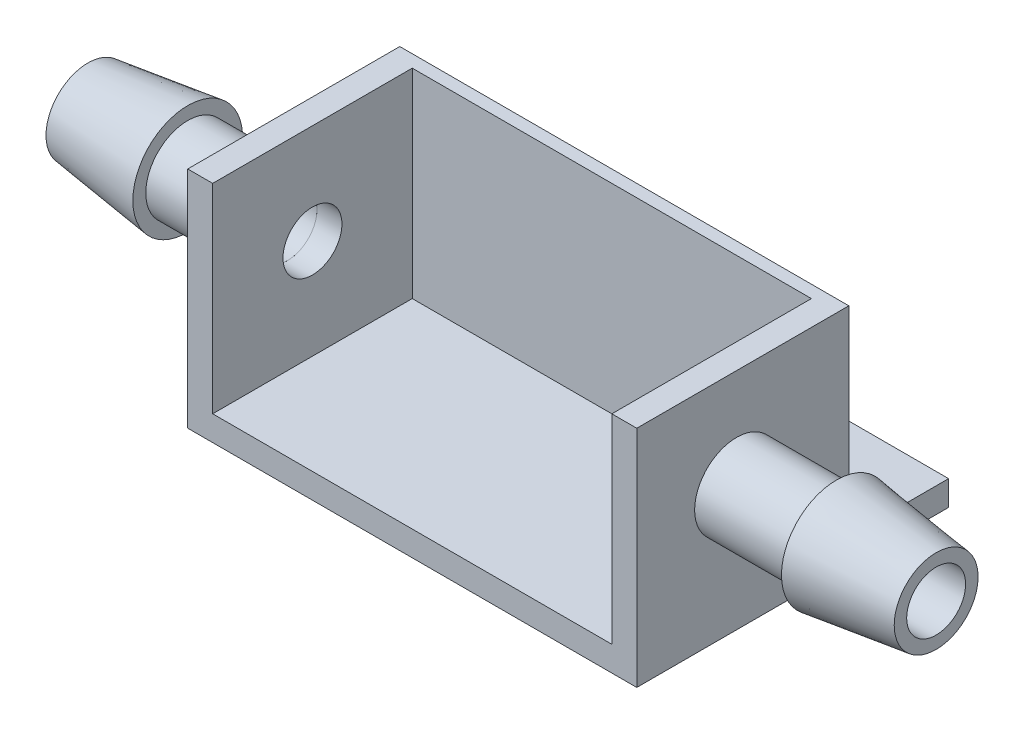
ISO-10303-21;
HEADER;
FILE_DESCRIPTION(('STEP AP214'),'2;1');
FILE_NAME('part.step','',(''),(''),'','','');
FILE_SCHEMA(('AUTOMOTIVE_DESIGN { 1 0 10303 214 1 1 1 1 }'));
ENDSEC;
DATA;
#1=APPLICATION_CONTEXT('core data for automotive mechanical design processes');
#2=APPLICATION_PROTOCOL_DEFINITION('international standard','automotive_design',2000,#1);
#3=PRODUCT_CONTEXT('',#1,'mechanical');
#4=PRODUCT('Part','Part','',(#3));
#5=PRODUCT_RELATED_PRODUCT_CATEGORY('part','',(#4));
#6=PRODUCT_DEFINITION_FORMATION('','',#4);
#7=PRODUCT_DEFINITION_CONTEXT('part definition',#1,'design');
#8=PRODUCT_DEFINITION('design','',#6,#7);
#9=PRODUCT_DEFINITION_SHAPE('','',#8);
#10=(LENGTH_UNIT() NAMED_UNIT(*) SI_UNIT(.MILLI.,.METRE.));
#11=(NAMED_UNIT(*) PLANE_ANGLE_UNIT() SI_UNIT($,.RADIAN.));
#12=(NAMED_UNIT(*) SI_UNIT($,.STERADIAN.) SOLID_ANGLE_UNIT());
#13=UNCERTAINTY_MEASURE_WITH_UNIT(LENGTH_MEASURE(1.E-05),#10,'distance_accuracy_value','');
#14=(GEOMETRIC_REPRESENTATION_CONTEXT(3) GLOBAL_UNCERTAINTY_ASSIGNED_CONTEXT((#13)) GLOBAL_UNIT_ASSIGNED_CONTEXT((#10,
#11,#12)) REPRESENTATION_CONTEXT('',''));
#15=CARTESIAN_POINT('',(0.,0.,0.));
#16=DIRECTION('',(0.,0.,1.));
#17=DIRECTION('',(1.,0.,0.));
#18=AXIS2_PLACEMENT_3D('',#15,#16,#17);
#19=CARTESIAN_POINT('',(-76.2,31.75,0.));
#20=DIRECTION('',(-1.,0.,0.));
#21=DIRECTION('',(0.,0.,1.));
#22=AXIS2_PLACEMENT_3D('',#19,#20,#21);
#23=CYLINDRICAL_SURFACE('',#22,7.50000000000003);
#24=CARTESIAN_POINT('',(107.95,31.75,0.));
#25=DIRECTION('',(-1.,0.,0.));
#26=DIRECTION('',(0.,0.,1.));
#27=AXIS2_PLACEMENT_3D('',#24,#25,#26);
#28=CIRCLE('',#27,7.50000000000003);
#29=CARTESIAN_POINT('',(107.95,31.75,7.50000000000003));
#30=VERTEX_POINT('',#29);
#31=EDGE_CURVE('E62',#30,#30,#28,.T.);
#32=ORIENTED_EDGE('',*,*,#31,.F.);
#33=EDGE_LOOP('',(#32));
#34=FACE_BOUND('',#33,.T.);
#35=CARTESIAN_POINT('',(57.15,31.75,0.));
#36=DIRECTION('',(-1.,0.,0.));
#37=DIRECTION('',(0.,0.,1.));
#38=AXIS2_PLACEMENT_3D('',#35,#36,#37);
#39=CIRCLE('',#38,7.50000000000002);
#40=CARTESIAN_POINT('',(57.15,31.75,7.50000000000002));
#41=VERTEX_POINT('',#40);
#42=EDGE_CURVE('E11',#41,#41,#39,.T.);
#43=ORIENTED_EDGE('',*,*,#42,.T.);
#44=EDGE_LOOP('',(#43));
#45=FACE_BOUND('',#44,.T.);
#46=ADVANCED_FACE('F40',(#34,#45),#23,.F.);
#47=CARTESIAN_POINT('',(57.15,39.25,0.));
#48=DIRECTION('',(1.,0.,0.));
#49=DIRECTION('',(0.,0.,-1.));
#50=AXIS2_PLACEMENT_3D('',#47,#48,#49);
#51=PLANE('',#50);
#52=ORIENTED_EDGE('',*,*,#42,.F.);
#53=EDGE_LOOP('',(#52));
#54=FACE_BOUND('',#53,.T.);
#55=CARTESIAN_POINT('',(57.15,31.75,0.));
#56=DIRECTION('',(-1.,0.,0.));
#57=DIRECTION('',(0.,0.,1.));
#58=AXIS2_PLACEMENT_3D('',#55,#56,#57);
#59=CIRCLE('',#58,10.675);
#60=CARTESIAN_POINT('',(57.15,31.75,10.675));
#61=VERTEX_POINT('',#60);
#62=EDGE_CURVE('E46',#61,#61,#59,.T.);
#63=ORIENTED_EDGE('',*,*,#62,.T.);
#64=EDGE_LOOP('',(#63));
#65=FACE_BOUND('',#64,.T.);
#66=ADVANCED_FACE('F69',(#54,#65),#51,.F.);
#67=CARTESIAN_POINT('',(-76.2,31.75,0.));
#68=DIRECTION('',(-1.,0.,0.));
#69=DIRECTION('',(0.,0.,1.));
#70=AXIS2_PLACEMENT_3D('',#67,#68,#69);
#71=CYLINDRICAL_SURFACE('',#70,10.675);
#72=ORIENTED_EDGE('',*,*,#62,.F.);
#73=EDGE_LOOP('',(#72));
#74=FACE_BOUND('',#73,.T.);
#75=CARTESIAN_POINT('',(82.55,31.75,0.));
#76=DIRECTION('',(-1.,0.,0.));
#77=DIRECTION('',(0.,0.,1.));
#78=AXIS2_PLACEMENT_3D('',#75,#76,#77);
#79=CIRCLE('',#78,10.675);
#80=CARTESIAN_POINT('',(82.55,31.75,10.675));
#81=VERTEX_POINT('',#80);
#82=EDGE_CURVE('E50',#81,#81,#79,.T.);
#83=ORIENTED_EDGE('',*,*,#82,.T.);
#84=EDGE_LOOP('',(#83));
#85=FACE_BOUND('',#84,.T.);
#86=ADVANCED_FACE('F73',(#74,#85),#71,.T.);
#87=CARTESIAN_POINT('',(82.55,42.425,0.));
#88=DIRECTION('',(1.,0.,0.));
#89=DIRECTION('',(0.,0.,-1.));
#90=AXIS2_PLACEMENT_3D('',#87,#88,#89);
#91=PLANE('',#90);
#92=ORIENTED_EDGE('',*,*,#82,.F.);
#93=EDGE_LOOP('',(#92));
#94=FACE_BOUND('',#93,.T.);
#95=CARTESIAN_POINT('',(82.55,31.75,0.));
#96=DIRECTION('',(-1.,0.,0.));
#97=DIRECTION('',(0.,0.,1.));
#98=AXIS2_PLACEMENT_3D('',#95,#96,#97);
#99=CIRCLE('',#98,13.97);
#100=CARTESIAN_POINT('',(82.55,31.75,13.97));
#101=VERTEX_POINT('',#100);
#102=EDGE_CURVE('E54',#101,#101,#99,.T.);
#103=ORIENTED_EDGE('',*,*,#102,.T.);
#104=EDGE_LOOP('',(#103));
#105=FACE_BOUND('',#104,.T.);
#106=ADVANCED_FACE('F78',(#94,#105),#91,.F.);
#107=CARTESIAN_POINT('',(107.95,31.75,0.));
#108=DIRECTION('',(-1.,0.,0.));
#109=DIRECTION('',(0.,0.,1.));
#110=AXIS2_PLACEMENT_3D('',#107,#108,#109);
#111=CONICAL_SURFACE('',#110,10.675,0.129003984032206);
#112=ORIENTED_EDGE('',*,*,#102,.F.);
#113=EDGE_LOOP('',(#112));
#114=FACE_BOUND('',#113,.T.);
#115=CARTESIAN_POINT('',(107.95,31.75,0.));
#116=DIRECTION('',(-1.,0.,0.));
#117=DIRECTION('',(0.,0.,1.));
#118=AXIS2_PLACEMENT_3D('',#115,#116,#117);
#119=CIRCLE('',#118,10.675);
#120=CARTESIAN_POINT('',(107.95,31.75,10.675));
#121=VERTEX_POINT('',#120);
#122=EDGE_CURVE('E59',#121,#121,#119,.T.);
#123=ORIENTED_EDGE('',*,*,#122,.T.);
#124=EDGE_LOOP('',(#123));
#125=FACE_BOUND('',#124,.T.);
#126=ADVANCED_FACE('F84',(#114,#125),#111,.T.);
#127=CARTESIAN_POINT('',(107.95,42.425,0.));
#128=DIRECTION('',(-1.,0.,0.));
#129=DIRECTION('',(0.,0.,1.));
#130=AXIS2_PLACEMENT_3D('',#127,#128,#129);
#131=PLANE('',#130);
#132=ORIENTED_EDGE('',*,*,#122,.F.);
#133=EDGE_LOOP('',(#132));
#134=FACE_BOUND('',#133,.T.);
#135=ORIENTED_EDGE('',*,*,#31,.T.);
#136=EDGE_LOOP('',(#135));
#137=FACE_BOUND('',#136,.T.);
#138=ADVANCED_FACE('F66',(#134,#137),#131,.F.);
#139=CLOSED_SHELL('',(#46,#66,#86,#106,#126,#138));
#140=MANIFOLD_SOLID_BREP('B2',#139);
#141=CARTESIAN_POINT('',(-57.15,39.25,0.));
#142=DIRECTION('',(-1.,0.,0.));
#143=DIRECTION('',(0.,0.,1.));
#144=AXIS2_PLACEMENT_3D('',#141,#142,#143);
#145=PLANE('',#144);
#146=CARTESIAN_POINT('',(-57.15,31.75,0.));
#147=DIRECTION('',(-1.,0.,0.));
#148=DIRECTION('',(0.,0.,1.));
#149=AXIS2_PLACEMENT_3D('',#146,#147,#148);
#150=CIRCLE('',#149,10.675);
#151=CARTESIAN_POINT('',(-57.15,31.75,10.675));
#152=VERTEX_POINT('',#151);
#153=EDGE_CURVE('E39',#152,#152,#150,.T.);
#154=ORIENTED_EDGE('',*,*,#153,.F.);
#155=EDGE_LOOP('',(#154));
#156=FACE_BOUND('',#155,.T.);
#157=CARTESIAN_POINT('',(-57.15,31.75,0.));
#158=DIRECTION('',(-1.,0.,0.));
#159=DIRECTION('',(0.,0.,1.));
#160=AXIS2_PLACEMENT_3D('',#157,#158,#159);
#161=CIRCLE('',#160,7.50000000000001);
#162=CARTESIAN_POINT('',(-57.15,31.75,7.50000000000001));
#163=VERTEX_POINT('',#162);
#164=EDGE_CURVE('E163',#163,#163,#161,.T.);
#165=ORIENTED_EDGE('',*,*,#164,.T.);
#166=EDGE_LOOP('',(#165));
#167=FACE_BOUND('',#166,.T.);
#168=ADVANCED_FACE('F141',(#156,#167),#145,.F.);
#169=CARTESIAN_POINT('',(-76.2,31.75,0.));
#170=DIRECTION('',(-1.,0.,0.));
#171=DIRECTION('',(0.,0.,1.));
#172=AXIS2_PLACEMENT_3D('',#169,#170,#171);
#173=CYLINDRICAL_SURFACE('',#172,10.675);
#174=CARTESIAN_POINT('',(-82.55,31.75,0.));
#175=DIRECTION('',(-1.,0.,0.));
#176=DIRECTION('',(0.,0.,1.));
#177=AXIS2_PLACEMENT_3D('',#174,#175,#176);
#178=CIRCLE('',#177,10.675);
#179=CARTESIAN_POINT('',(-82.55,31.75,10.675));
#180=VERTEX_POINT('',#179);
#181=EDGE_CURVE('E147',#180,#180,#178,.T.);
#182=ORIENTED_EDGE('',*,*,#181,.F.);
#183=EDGE_LOOP('',(#182));
#184=FACE_BOUND('',#183,.T.);
#185=ORIENTED_EDGE('',*,*,#153,.T.);
#186=EDGE_LOOP('',(#185));
#187=FACE_BOUND('',#186,.T.);
#188=ADVANCED_FACE('F188',(#184,#187),#173,.T.);
#189=CARTESIAN_POINT('',(-82.55,42.425,0.));
#190=DIRECTION('',(-1.,0.,0.));
#191=DIRECTION('',(0.,0.,1.));
#192=AXIS2_PLACEMENT_3D('',#189,#190,#191);
#193=PLANE('',#192);
#194=CARTESIAN_POINT('',(-82.55,31.75,0.));
#195=DIRECTION('',(-1.,0.,0.));
#196=DIRECTION('',(0.,0.,1.));
#197=AXIS2_PLACEMENT_3D('',#194,#195,#196);
#198=CIRCLE('',#197,13.97);
#199=CARTESIAN_POINT('',(-82.55,31.75,13.97));
#200=VERTEX_POINT('',#199);
#201=EDGE_CURVE('E151',#200,#200,#198,.T.);
#202=ORIENTED_EDGE('',*,*,#201,.F.);
#203=EDGE_LOOP('',(#202));
#204=FACE_BOUND('',#203,.T.);
#205=ORIENTED_EDGE('',*,*,#181,.T.);
#206=EDGE_LOOP('',(#205));
#207=FACE_BOUND('',#206,.T.);
#208=ADVANCED_FACE('F183',(#204,#207),#193,.F.);
#209=CARTESIAN_POINT('',(-82.55,31.75,0.));
#210=DIRECTION('',(1.,0.,0.));
#211=DIRECTION('',(0.,0.,-1.));
#212=AXIS2_PLACEMENT_3D('',#209,#210,#211);
#213=CONICAL_SURFACE('',#212,13.97,0.129003984032206);
#214=CARTESIAN_POINT('',(-107.95,31.75,0.));
#215=DIRECTION('',(-1.,0.,0.));
#216=DIRECTION('',(0.,0.,1.));
#217=AXIS2_PLACEMENT_3D('',#214,#215,#216);
#218=CIRCLE('',#217,10.675);
#219=CARTESIAN_POINT('',(-107.95,31.75,10.675));
#220=VERTEX_POINT('',#219);
#221=EDGE_CURVE('E155',#220,#220,#218,.T.);
#222=ORIENTED_EDGE('',*,*,#221,.F.);
#223=EDGE_LOOP('',(#222));
#224=FACE_BOUND('',#223,.T.);
#225=ORIENTED_EDGE('',*,*,#201,.T.);
#226=EDGE_LOOP('',(#225));
#227=FACE_BOUND('',#226,.T.);
#228=ADVANCED_FACE('F177',(#224,#227),#213,.T.);
#229=CARTESIAN_POINT('',(-107.95,42.425,0.));
#230=DIRECTION('',(1.,0.,0.));
#231=DIRECTION('',(0.,0.,-1.));
#232=AXIS2_PLACEMENT_3D('',#229,#230,#231);
#233=PLANE('',#232);
#234=CARTESIAN_POINT('',(-107.95,31.75,0.));
#235=DIRECTION('',(-1.,0.,0.));
#236=DIRECTION('',(0.,0.,1.));
#237=AXIS2_PLACEMENT_3D('',#234,#235,#236);
#238=CIRCLE('',#237,7.50000000000001);
#239=CARTESIAN_POINT('',(-107.95,31.75,7.50000000000001));
#240=VERTEX_POINT('',#239);
#241=EDGE_CURVE('E160',#240,#240,#238,.T.);
#242=ORIENTED_EDGE('',*,*,#241,.F.);
#243=EDGE_LOOP('',(#242));
#244=FACE_BOUND('',#243,.T.);
#245=ORIENTED_EDGE('',*,*,#221,.T.);
#246=EDGE_LOOP('',(#245));
#247=FACE_BOUND('',#246,.T.);
#248=ADVANCED_FACE('F171',(#244,#247),#233,.F.);
#249=CARTESIAN_POINT('',(-76.2,31.75,0.));
#250=DIRECTION('',(-1.,0.,0.));
#251=DIRECTION('',(0.,0.,1.));
#252=AXIS2_PLACEMENT_3D('',#249,#250,#251);
#253=CYLINDRICAL_SURFACE('',#252,7.50000000000001);
#254=ORIENTED_EDGE('',*,*,#164,.F.);
#255=EDGE_LOOP('',(#254));
#256=FACE_BOUND('',#255,.T.);
#257=ORIENTED_EDGE('',*,*,#241,.T.);
#258=EDGE_LOOP('',(#257));
#259=FACE_BOUND('',#258,.T.);
#260=ADVANCED_FACE('F168',(#256,#259),#253,.F.);
#261=CLOSED_SHELL('',(#168,#188,#208,#228,#248,#260));
#262=MANIFOLD_SOLID_BREP('B6',#261);
#263=CARTESIAN_POINT('',(0.,0.,-28.575));
#264=DIRECTION('',(0.,0.,-1.));
#265=DIRECTION('',(-1.,0.,0.));
#266=AXIS2_PLACEMENT_3D('',#263,#264,#265);
#267=PLANE('',#266);
#268=DIRECTION('',(0.,-1.,0.));
#269=VECTOR('',#268,1.);
#270=CARTESIAN_POINT('',(57.15,57.15,-28.575));
#271=LINE('',#270,#269);
#272=CARTESIAN_POINT('',(57.15,57.15,-28.575));
#273=VERTEX_POINT('',#272);
#274=CARTESIAN_POINT('',(57.15,6.35,-28.575));
#275=VERTEX_POINT('',#274);
#276=EDGE_CURVE('E392',#273,#275,#271,.T.);
#277=ORIENTED_EDGE('',*,*,#276,.T.);
#278=DIRECTION('',(-1.,0.,0.));
#279=VECTOR('',#278,1.);
#280=CARTESIAN_POINT('',(-57.15,6.35,-28.575));
#281=LINE('',#280,#279);
#282=CARTESIAN_POINT('',(-57.15,6.35,-28.575));
#283=VERTEX_POINT('',#282);
#284=EDGE_CURVE('E378',#275,#283,#281,.T.);
#285=ORIENTED_EDGE('',*,*,#284,.T.);
#286=DIRECTION('',(0.,1.,0.));
#287=VECTOR('',#286,1.);
#288=CARTESIAN_POINT('',(-57.15,57.15,-28.575));
#289=LINE('',#288,#287);
#290=CARTESIAN_POINT('',(-57.15,57.15,-28.575));
#291=VERTEX_POINT('',#290);
#292=EDGE_CURVE('E395',#283,#291,#289,.T.);
#293=ORIENTED_EDGE('',*,*,#292,.T.);
#294=DIRECTION('',(1.,0.,0.));
#295=VECTOR('',#294,1.);
#296=CARTESIAN_POINT('',(57.15,57.15,-28.575));
#297=LINE('',#296,#295);
#298=EDGE_CURVE('E329',#291,#273,#297,.T.);
#299=ORIENTED_EDGE('',*,*,#298,.T.);
#300=EDGE_LOOP('',(#277,#285,#293,#299));
#301=FACE_BOUND('',#300,.T.);
#302=ADVANCED_FACE('F233',(#301),#267,.T.);
#303=CARTESIAN_POINT('',(-57.15,0.,25.4));
#304=DIRECTION('',(0.,1.,0.));
#305=DIRECTION('',(0.,0.,1.));
#306=AXIS2_PLACEMENT_3D('',#303,#304,#305);
#307=PLANE('',#306);
#308=DIRECTION('',(0.,0.,-1.));
#309=VECTOR('',#308,1.);
#310=CARTESIAN_POINT('',(-57.15,0.,25.4));
#311=LINE('',#310,#309);
#312=CARTESIAN_POINT('',(-57.15,0.,25.4));
#313=VERTEX_POINT('',#312);
#314=CARTESIAN_POINT('',(-57.15,0.,-53.975));
#315=VERTEX_POINT('',#314);
#316=EDGE_CURVE('E139',#313,#315,#311,.T.);
#317=ORIENTED_EDGE('',*,*,#316,.T.);
#318=DIRECTION('',(1.,0.,0.));
#319=VECTOR('',#318,1.);
#320=CARTESIAN_POINT('',(-57.15,0.,-53.975));
#321=LINE('',#320,#319);
#322=CARTESIAN_POINT('',(57.15,0.,-53.975));
#323=VERTEX_POINT('',#322);
#324=EDGE_CURVE('E365',#315,#323,#321,.T.);
#325=ORIENTED_EDGE('',*,*,#324,.T.);
#326=DIRECTION('',(0.,0.,-1.));
#327=VECTOR('',#326,1.);
#328=CARTESIAN_POINT('',(57.15,0.,25.4));
#329=LINE('',#328,#327);
#330=CARTESIAN_POINT('',(57.15,0.,25.4));
#331=VERTEX_POINT('',#330);
#332=EDGE_CURVE('E242',#331,#323,#329,.T.);
#333=ORIENTED_EDGE('',*,*,#332,.F.);
#334=DIRECTION('',(1.,0.,0.));
#335=VECTOR('',#334,1.);
#336=CARTESIAN_POINT('',(-57.15,0.,25.4));
#337=LINE('',#336,#335);
#338=EDGE_CURVE('E403',#313,#331,#337,.T.);
#339=ORIENTED_EDGE('',*,*,#338,.F.);
#340=EDGE_LOOP('',(#317,#325,#333,#339));
#341=FACE_BOUND('',#340,.T.);
#342=CARTESIAN_POINT('',(-38.1,0.,-41.2750000000005));
#343=DIRECTION('',(0.,-1.,0.));
#344=DIRECTION('',(0.,0.,-1.));
#345=AXIS2_PLACEMENT_3D('',#342,#343,#344);
#346=CIRCLE('',#345,3.49250000000001);
#347=CARTESIAN_POINT('',(-38.1,0.,-44.7675000000005));
#348=VERTEX_POINT('',#347);
#349=EDGE_CURVE('E440',#348,#348,#346,.T.);
#350=ORIENTED_EDGE('',*,*,#349,.F.);
#351=EDGE_LOOP('',(#350));
#352=FACE_BOUND('',#351,.T.);
#353=CARTESIAN_POINT('',(-12.7,0.,-41.2750000000004));
#354=DIRECTION('',(0.,-1.,0.));
#355=DIRECTION('',(0.,0.,-1.));
#356=AXIS2_PLACEMENT_3D('',#353,#354,#355);
#357=CIRCLE('',#356,3.49250000000001);
#358=CARTESIAN_POINT('',(-12.7,0.,-44.7675000000004));
#359=VERTEX_POINT('',#358);
#360=EDGE_CURVE('E434',#359,#359,#357,.T.);
#361=ORIENTED_EDGE('',*,*,#360,.F.);
#362=EDGE_LOOP('',(#361));
#363=FACE_BOUND('',#362,.T.);
#364=CARTESIAN_POINT('',(12.7,0.,-41.2750000000002));
#365=DIRECTION('',(0.,-1.,0.));
#366=DIRECTION('',(0.,0.,-1.));
#367=AXIS2_PLACEMENT_3D('',#364,#365,#366);
#368=CIRCLE('',#367,3.49250000000001);
#369=CARTESIAN_POINT('',(12.7,0.,-44.7675000000002));
#370=VERTEX_POINT('',#369);
#371=EDGE_CURVE('E428',#370,#370,#368,.T.);
#372=ORIENTED_EDGE('',*,*,#371,.F.);
#373=EDGE_LOOP('',(#372));
#374=FACE_BOUND('',#373,.T.);
#375=CARTESIAN_POINT('',(38.1,0.,-41.275));
#376=DIRECTION('',(0.,-1.,0.));
#377=DIRECTION('',(0.,0.,-1.));
#378=AXIS2_PLACEMENT_3D('',#375,#376,#377);
#379=CIRCLE('',#378,3.49250000000001);
#380=CARTESIAN_POINT('',(38.1,0.,-44.7675));
#381=VERTEX_POINT('',#380);
#382=EDGE_CURVE('E375',#381,#381,#379,.T.);
#383=ORIENTED_EDGE('',*,*,#382,.F.);
#384=EDGE_LOOP('',(#383));
#385=FACE_BOUND('',#384,.T.);
#386=ADVANCED_FACE('F235',(#341,#352,#363,#374,#385),#307,.F.);
#387=CARTESIAN_POINT('',(57.15,6.34999999999999,25.4));
#388=DIRECTION('',(-1.,0.,0.));
#389=DIRECTION('',(0.,0.,1.));
#390=AXIS2_PLACEMENT_3D('',#387,#388,#389);
#391=PLANE('',#390);
#392=CARTESIAN_POINT('',(57.15,31.75,0.));
#393=DIRECTION('',(-1.,0.,0.));
#394=DIRECTION('',(0.,0.,1.));
#395=AXIS2_PLACEMENT_3D('',#392,#393,#394);
#396=CIRCLE('',#395,7.5);
#397=CARTESIAN_POINT('',(57.15,31.75,7.5));
#398=VERTEX_POINT('',#397);
#399=EDGE_CURVE('E388',#398,#398,#396,.T.);
#400=ORIENTED_EDGE('',*,*,#399,.T.);
#401=EDGE_LOOP('',(#400));
#402=FACE_BOUND('',#401,.T.);
#403=ORIENTED_EDGE('',*,*,#332,.T.);
#404=DIRECTION('',(0.,-1.,0.));
#405=VECTOR('',#404,1.);
#406=CARTESIAN_POINT('',(57.15,6.35,-53.975));
#407=LINE('',#406,#405);
#408=CARTESIAN_POINT('',(57.15,6.35,-53.975));
#409=VERTEX_POINT('',#408);
#410=EDGE_CURVE('E351',#409,#323,#407,.T.);
#411=ORIENTED_EDGE('',*,*,#410,.F.);
#412=DIRECTION('',(0.,0.,1.));
#413=VECTOR('',#412,1.);
#414=CARTESIAN_POINT('',(57.15,6.35,-28.575));
#415=LINE('',#414,#413);
#416=EDGE_CURVE('E422',#409,#275,#415,.T.);
#417=ORIENTED_EDGE('',*,*,#416,.T.);
#418=ORIENTED_EDGE('',*,*,#276,.F.);
#419=DIRECTION('',(0.,0.,-1.));
#420=VECTOR('',#419,1.);
#421=CARTESIAN_POINT('',(57.15,57.15,25.4));
#422=LINE('',#421,#420);
#423=CARTESIAN_POINT('',(57.15,57.15,25.4));
#424=VERTEX_POINT('',#423);
#425=EDGE_CURVE('E338',#424,#273,#422,.T.);
#426=ORIENTED_EDGE('',*,*,#425,.F.);
#427=DIRECTION('',(0.,1.,0.));
#428=VECTOR('',#427,1.);
#429=CARTESIAN_POINT('',(57.15,0.,25.4));
#430=LINE('',#429,#428);
#431=EDGE_CURVE('E354',#331,#424,#430,.T.);
#432=ORIENTED_EDGE('',*,*,#431,.F.);
#433=EDGE_LOOP('',(#403,#411,#417,#418,#426,#432));
#434=FACE_BOUND('',#433,.T.);
#435=ADVANCED_FACE('F348',(#402,#434),#391,.F.);
#436=CARTESIAN_POINT('',(50.8,6.34999999999999,25.4));
#437=DIRECTION('',(1.,0.,0.));
#438=DIRECTION('',(0.,0.,-1.));
#439=AXIS2_PLACEMENT_3D('',#436,#437,#438);
#440=PLANE('',#439);
#441=CARTESIAN_POINT('',(50.8,31.75,0.));
#442=DIRECTION('',(1.,0.,0.));
#443=DIRECTION('',(0.,0.,-1.));
#444=AXIS2_PLACEMENT_3D('',#441,#442,#443);
#445=CIRCLE('',#444,7.5);
#446=CARTESIAN_POINT('',(50.8,31.75,-7.5));
#447=VERTEX_POINT('',#446);
#448=EDGE_CURVE('E385',#447,#447,#445,.T.);
#449=ORIENTED_EDGE('',*,*,#448,.T.);
#450=EDGE_LOOP('',(#449));
#451=FACE_BOUND('',#450,.T.);
#452=DIRECTION('',(0.,-1.,0.));
#453=VECTOR('',#452,1.);
#454=CARTESIAN_POINT('',(50.8,6.34999999999999,-25.4));
#455=LINE('',#454,#453);
#456=CARTESIAN_POINT('',(50.8,57.15,-25.4));
#457=VERTEX_POINT('',#456);
#458=CARTESIAN_POINT('',(50.8,6.34999999999999,-25.4));
#459=VERTEX_POINT('',#458);
#460=EDGE_CURVE('E327',#457,#459,#455,.T.);
#461=ORIENTED_EDGE('',*,*,#460,.T.);
#462=DIRECTION('',(0.,0.,-1.));
#463=VECTOR('',#462,1.);
#464=CARTESIAN_POINT('',(50.8,6.34999999999999,25.4));
#465=LINE('',#464,#463);
#466=CARTESIAN_POINT('',(50.8,6.34999999999999,25.4));
#467=VERTEX_POINT('',#466);
#468=EDGE_CURVE('E315',#467,#459,#465,.T.);
#469=ORIENTED_EDGE('',*,*,#468,.F.);
#470=DIRECTION('',(0.,-1.,0.));
#471=VECTOR('',#470,1.);
#472=CARTESIAN_POINT('',(50.8,6.34999999999999,25.4));
#473=LINE('',#472,#471);
#474=CARTESIAN_POINT('',(50.8,57.15,25.4));
#475=VERTEX_POINT('',#474);
#476=EDGE_CURVE('E306',#475,#467,#473,.T.);
#477=ORIENTED_EDGE('',*,*,#476,.F.);
#478=DIRECTION('',(0.,0.,-1.));
#479=VECTOR('',#478,1.);
#480=CARTESIAN_POINT('',(50.8,57.15,25.4));
#481=LINE('',#480,#479);
#482=EDGE_CURVE('E335',#475,#457,#481,.T.);
#483=ORIENTED_EDGE('',*,*,#482,.T.);
#484=EDGE_LOOP('',(#461,#469,#477,#483));
#485=FACE_BOUND('',#484,.T.);
#486=ADVANCED_FACE('F412',(#451,#485),#440,.F.);
#487=CARTESIAN_POINT('',(-50.8,6.34999999999999,25.4));
#488=DIRECTION('',(0.,-1.,0.));
#489=DIRECTION('',(0.,0.,-1.));
#490=AXIS2_PLACEMENT_3D('',#487,#488,#489);
#491=PLANE('',#490);
#492=DIRECTION('',(-1.,0.,0.));
#493=VECTOR('',#492,1.);
#494=CARTESIAN_POINT('',(-50.8,6.34999999999999,-25.4));
#495=LINE('',#494,#493);
#496=CARTESIAN_POINT('',(-50.8,6.34999999999999,-25.4));
#497=VERTEX_POINT('',#496);
#498=EDGE_CURVE('E272',#459,#497,#495,.T.);
#499=ORIENTED_EDGE('',*,*,#498,.T.);
#500=DIRECTION('',(0.,0.,-1.));
#501=VECTOR('',#500,1.);
#502=CARTESIAN_POINT('',(-50.8,6.34999999999999,25.4));
#503=LINE('',#502,#501);
#504=CARTESIAN_POINT('',(-50.8,6.34999999999999,25.4));
#505=VERTEX_POINT('',#504);
#506=EDGE_CURVE('E312',#505,#497,#503,.T.);
#507=ORIENTED_EDGE('',*,*,#506,.F.);
#508=DIRECTION('',(-1.,0.,0.));
#509=VECTOR('',#508,1.);
#510=CARTESIAN_POINT('',(-50.8,6.34999999999999,25.4));
#511=LINE('',#510,#509);
#512=EDGE_CURVE('E299',#467,#505,#511,.T.);
#513=ORIENTED_EDGE('',*,*,#512,.F.);
#514=ORIENTED_EDGE('',*,*,#468,.T.);
#515=EDGE_LOOP('',(#499,#507,#513,#514));
#516=FACE_BOUND('',#515,.T.);
#517=ADVANCED_FACE('F313',(#516),#491,.F.);
#518=CARTESIAN_POINT('',(-50.8,6.34999999999999,25.4));
#519=DIRECTION('',(-1.,0.,0.));
#520=DIRECTION('',(0.,0.,1.));
#521=AXIS2_PLACEMENT_3D('',#518,#519,#520);
#522=PLANE('',#521);
#523=CARTESIAN_POINT('',(-50.8,31.75,0.));
#524=DIRECTION('',(-1.,0.,0.));
#525=DIRECTION('',(0.,0.,1.));
#526=AXIS2_PLACEMENT_3D('',#523,#524,#525);
#527=CIRCLE('',#526,7.5);
#528=CARTESIAN_POINT('',(-50.8,31.75,7.5));
#529=VERTEX_POINT('',#528);
#530=EDGE_CURVE('E382',#529,#529,#527,.T.);
#531=ORIENTED_EDGE('',*,*,#530,.T.);
#532=EDGE_LOOP('',(#531));
#533=FACE_BOUND('',#532,.T.);
#534=DIRECTION('',(0.,1.,0.));
#535=VECTOR('',#534,1.);
#536=CARTESIAN_POINT('',(-50.8,6.34999999999999,-25.4));
#537=LINE('',#536,#535);
#538=CARTESIAN_POINT('',(-50.8,57.15,-25.4));
#539=VERTEX_POINT('',#538);
#540=EDGE_CURVE('E281',#497,#539,#537,.T.);
#541=ORIENTED_EDGE('',*,*,#540,.T.);
#542=DIRECTION('',(0.,0.,-1.));
#543=VECTOR('',#542,1.);
#544=CARTESIAN_POINT('',(-50.8,57.15,25.4));
#545=LINE('',#544,#543);
#546=CARTESIAN_POINT('',(-50.8,57.15,25.4));
#547=VERTEX_POINT('',#546);
#548=EDGE_CURVE('E316',#547,#539,#545,.T.);
#549=ORIENTED_EDGE('',*,*,#548,.F.);
#550=DIRECTION('',(0.,1.,0.));
#551=VECTOR('',#550,1.);
#552=CARTESIAN_POINT('',(-50.8,6.34999999999999,25.4));
#553=LINE('',#552,#551);
#554=EDGE_CURVE('E303',#505,#547,#553,.T.);
#555=ORIENTED_EDGE('',*,*,#554,.F.);
#556=ORIENTED_EDGE('',*,*,#506,.T.);
#557=EDGE_LOOP('',(#541,#549,#555,#556));
#558=FACE_BOUND('',#557,.T.);
#559=ADVANCED_FACE('F318',(#533,#558),#522,.F.);
#560=CARTESIAN_POINT('',(-57.15,57.15,25.4));
#561=DIRECTION('',(0.,-1.,0.));
#562=DIRECTION('',(0.,0.,-1.));
#563=AXIS2_PLACEMENT_3D('',#560,#561,#562);
#564=PLANE('',#563);
#565=ORIENTED_EDGE('',*,*,#548,.T.);
#566=DIRECTION('',(1.,0.,0.));
#567=VECTOR('',#566,1.);
#568=CARTESIAN_POINT('',(57.15,57.15,-25.4));
#569=LINE('',#568,#567);
#570=EDGE_CURVE('E391',#539,#457,#569,.T.);
#571=ORIENTED_EDGE('',*,*,#570,.T.);
#572=ORIENTED_EDGE('',*,*,#482,.F.);
#573=DIRECTION('',(-1.,0.,0.));
#574=VECTOR('',#573,1.);
#575=CARTESIAN_POINT('',(57.15,57.15,25.4));
#576=LINE('',#575,#574);
#577=EDGE_CURVE('E406',#424,#475,#576,.T.);
#578=ORIENTED_EDGE('',*,*,#577,.F.);
#579=ORIENTED_EDGE('',*,*,#425,.T.);
#580=ORIENTED_EDGE('',*,*,#298,.F.);
#581=DIRECTION('',(0.,0.,-1.));
#582=VECTOR('',#581,1.);
#583=CARTESIAN_POINT('',(-57.15,57.15,25.4));
#584=LINE('',#583,#582);
#585=CARTESIAN_POINT('',(-57.15,57.15,25.4));
#586=VERTEX_POINT('',#585);
#587=EDGE_CURVE('E323',#586,#291,#584,.T.);
#588=ORIENTED_EDGE('',*,*,#587,.F.);
#589=DIRECTION('',(-1.,0.,0.));
#590=VECTOR('',#589,1.);
#591=CARTESIAN_POINT('',(-57.15,57.15,25.4));
#592=LINE('',#591,#590);
#593=EDGE_CURVE('E321',#547,#586,#592,.T.);
#594=ORIENTED_EDGE('',*,*,#593,.F.);
#595=EDGE_LOOP('',(#565,#571,#572,#578,#579,#580,#588,#594));
#596=FACE_BOUND('',#595,.T.);
#597=ADVANCED_FACE('F410',(#596),#564,.F.);
#598=CARTESIAN_POINT('',(-57.15,6.34999999999999,25.4));
#599=DIRECTION('',(1.,0.,0.));
#600=DIRECTION('',(0.,0.,-1.));
#601=AXIS2_PLACEMENT_3D('',#598,#599,#600);
#602=PLANE('',#601);
#603=CARTESIAN_POINT('',(-57.15,31.75,0.));
#604=DIRECTION('',(1.,0.,0.));
#605=DIRECTION('',(0.,0.,-1.));
#606=AXIS2_PLACEMENT_3D('',#603,#604,#605);
#607=CIRCLE('',#606,7.5);
#608=CARTESIAN_POINT('',(-57.15,31.75,-7.5));
#609=VERTEX_POINT('',#608);
#610=EDGE_CURVE('E237',#609,#609,#607,.T.);
#611=ORIENTED_EDGE('',*,*,#610,.T.);
#612=EDGE_LOOP('',(#611));
#613=FACE_BOUND('',#612,.T.);
#614=ORIENTED_EDGE('',*,*,#587,.T.);
#615=ORIENTED_EDGE('',*,*,#292,.F.);
#616=DIRECTION('',(0.,0.,-1.));
#617=VECTOR('',#616,1.);
#618=CARTESIAN_POINT('',(-57.15,6.35,-28.575));
#619=LINE('',#618,#617);
#620=CARTESIAN_POINT('',(-57.15,6.35,-53.975));
#621=VERTEX_POINT('',#620);
#622=EDGE_CURVE('E249',#283,#621,#619,.T.);
#623=ORIENTED_EDGE('',*,*,#622,.T.);
#624=DIRECTION('',(0.,-1.,0.));
#625=VECTOR('',#624,1.);
#626=CARTESIAN_POINT('',(-57.15,6.35,-53.975));
#627=LINE('',#626,#625);
#628=EDGE_CURVE('E367',#621,#315,#627,.T.);
#629=ORIENTED_EDGE('',*,*,#628,.T.);
#630=ORIENTED_EDGE('',*,*,#316,.F.);
#631=DIRECTION('',(0.,-1.,0.));
#632=VECTOR('',#631,1.);
#633=CARTESIAN_POINT('',(-57.15,0.,25.4));
#634=LINE('',#633,#632);
#635=EDGE_CURVE('E258',#586,#313,#634,.T.);
#636=ORIENTED_EDGE('',*,*,#635,.F.);
#637=EDGE_LOOP('',(#614,#615,#623,#629,#630,#636));
#638=FACE_BOUND('',#637,.T.);
#639=ADVANCED_FACE('F417',(#613,#638),#602,.F.);
#640=CARTESIAN_POINT('',(0.,0.,25.4));
#641=DIRECTION('',(0.,0.,-1.));
#642=DIRECTION('',(-1.,0.,0.));
#643=AXIS2_PLACEMENT_3D('',#640,#641,#642);
#644=PLANE('',#643);
#645=ORIENTED_EDGE('',*,*,#635,.T.);
#646=ORIENTED_EDGE('',*,*,#338,.T.);
#647=ORIENTED_EDGE('',*,*,#431,.T.);
#648=ORIENTED_EDGE('',*,*,#577,.T.);
#649=ORIENTED_EDGE('',*,*,#476,.T.);
#650=ORIENTED_EDGE('',*,*,#512,.T.);
#651=ORIENTED_EDGE('',*,*,#554,.T.);
#652=ORIENTED_EDGE('',*,*,#593,.T.);
#653=EDGE_LOOP('',(#645,#646,#647,#648,#649,#650,#651,#652));
#654=FACE_BOUND('',#653,.T.);
#655=ADVANCED_FACE('F301',(#654),#644,.F.);
#656=CARTESIAN_POINT('',(0.,0.,-25.4));
#657=DIRECTION('',(0.,0.,-1.));
#658=DIRECTION('',(-1.,0.,0.));
#659=AXIS2_PLACEMENT_3D('',#656,#657,#658);
#660=PLANE('',#659);
#661=ORIENTED_EDGE('',*,*,#540,.F.);
#662=ORIENTED_EDGE('',*,*,#498,.F.);
#663=ORIENTED_EDGE('',*,*,#460,.F.);
#664=ORIENTED_EDGE('',*,*,#570,.F.);
#665=EDGE_LOOP('',(#661,#662,#663,#664));
#666=FACE_BOUND('',#665,.T.);
#667=ADVANCED_FACE('F413',(#666),#660,.F.);
#668=CARTESIAN_POINT('',(-107.95,31.75,0.));
#669=DIRECTION('',(1.,0.,0.));
#670=DIRECTION('',(0.,0.,-1.));
#671=AXIS2_PLACEMENT_3D('',#668,#669,#670);
#672=CYLINDRICAL_SURFACE('',#671,7.5);
#673=ORIENTED_EDGE('',*,*,#610,.F.);
#674=EDGE_LOOP('',(#673));
#675=FACE_BOUND('',#674,.T.);
#676=ORIENTED_EDGE('',*,*,#530,.F.);
#677=EDGE_LOOP('',(#676));
#678=FACE_BOUND('',#677,.T.);
#679=ADVANCED_FACE('F486',(#675,#678),#672,.F.);
#680=ORIENTED_EDGE('',*,*,#448,.F.);
#681=EDGE_LOOP('',(#680));
#682=FACE_BOUND('',#681,.T.);
#683=ORIENTED_EDGE('',*,*,#399,.F.);
#684=EDGE_LOOP('',(#683));
#685=FACE_BOUND('',#684,.T.);
#686=ADVANCED_FACE('F482',(#682,#685),#672,.F.);
#687=CARTESIAN_POINT('',(-57.15,6.35,-53.975));
#688=DIRECTION('',(0.,0.,-1.));
#689=DIRECTION('',(-1.,0.,0.));
#690=AXIS2_PLACEMENT_3D('',#687,#688,#689);
#691=PLANE('',#690);
#692=ORIENTED_EDGE('',*,*,#324,.F.);
#693=ORIENTED_EDGE('',*,*,#628,.F.);
#694=DIRECTION('',(1.,0.,0.));
#695=VECTOR('',#694,1.);
#696=CARTESIAN_POINT('',(-57.15,6.35,-53.975));
#697=LINE('',#696,#695);
#698=EDGE_CURVE('E366',#621,#409,#697,.T.);
#699=ORIENTED_EDGE('',*,*,#698,.T.);
#700=ORIENTED_EDGE('',*,*,#410,.T.);
#701=EDGE_LOOP('',(#692,#693,#699,#700));
#702=FACE_BOUND('',#701,.T.);
#703=ADVANCED_FACE('F363',(#702),#691,.T.);
#704=CARTESIAN_POINT('',(0.,6.35,0.));
#705=DIRECTION('',(0.,-1.,0.));
#706=DIRECTION('',(0.,0.,-1.));
#707=AXIS2_PLACEMENT_3D('',#704,#705,#706);
#708=PLANE('',#707);
#709=CARTESIAN_POINT('',(-38.1,6.35,-41.2750000000005));
#710=DIRECTION('',(0.,-1.,0.));
#711=DIRECTION('',(0.,0.,-1.));
#712=AXIS2_PLACEMENT_3D('',#709,#710,#711);
#713=CIRCLE('',#712,3.49250000000001);
#714=CARTESIAN_POINT('',(-38.1,6.35,-44.7675000000005));
#715=VERTEX_POINT('',#714);
#716=EDGE_CURVE('E437',#715,#715,#713,.T.);
#717=ORIENTED_EDGE('',*,*,#716,.T.);
#718=EDGE_LOOP('',(#717));
#719=FACE_BOUND('',#718,.T.);
#720=CARTESIAN_POINT('',(-12.7,6.35,-41.2750000000004));
#721=DIRECTION('',(0.,-1.,0.));
#722=DIRECTION('',(0.,0.,-1.));
#723=AXIS2_PLACEMENT_3D('',#720,#721,#722);
#724=CIRCLE('',#723,3.49250000000001);
#725=CARTESIAN_POINT('',(-12.7,6.35,-44.7675000000004));
#726=VERTEX_POINT('',#725);
#727=EDGE_CURVE('E431',#726,#726,#724,.T.);
#728=ORIENTED_EDGE('',*,*,#727,.T.);
#729=EDGE_LOOP('',(#728));
#730=FACE_BOUND('',#729,.T.);
#731=CARTESIAN_POINT('',(12.7,6.35,-41.2750000000002));
#732=DIRECTION('',(0.,-1.,0.));
#733=DIRECTION('',(0.,0.,-1.));
#734=AXIS2_PLACEMENT_3D('',#731,#732,#733);
#735=CIRCLE('',#734,3.49250000000001);
#736=CARTESIAN_POINT('',(12.7,6.35,-44.7675000000002));
#737=VERTEX_POINT('',#736);
#738=EDGE_CURVE('E426',#737,#737,#735,.T.);
#739=ORIENTED_EDGE('',*,*,#738,.T.);
#740=EDGE_LOOP('',(#739));
#741=FACE_BOUND('',#740,.T.);
#742=CARTESIAN_POINT('',(38.1,6.35,-41.275));
#743=DIRECTION('',(0.,-1.,0.));
#744=DIRECTION('',(0.,0.,-1.));
#745=AXIS2_PLACEMENT_3D('',#742,#743,#744);
#746=CIRCLE('',#745,3.49250000000001);
#747=CARTESIAN_POINT('',(38.1,6.35,-44.7675));
#748=VERTEX_POINT('',#747);
#749=EDGE_CURVE('E371',#748,#748,#746,.T.);
#750=ORIENTED_EDGE('',*,*,#749,.T.);
#751=EDGE_LOOP('',(#750));
#752=FACE_BOUND('',#751,.T.);
#753=ORIENTED_EDGE('',*,*,#622,.F.);
#754=ORIENTED_EDGE('',*,*,#284,.F.);
#755=ORIENTED_EDGE('',*,*,#416,.F.);
#756=ORIENTED_EDGE('',*,*,#698,.F.);
#757=EDGE_LOOP('',(#753,#754,#755,#756));
#758=FACE_BOUND('',#757,.T.);
#759=ADVANCED_FACE('F421',(#719,#730,#741,#752,#758),#708,.F.);
#760=CARTESIAN_POINT('',(38.1,6.35,-41.275));
#761=DIRECTION('',(0.,-1.,0.));
#762=DIRECTION('',(0.,0.,-1.));
#763=AXIS2_PLACEMENT_3D('',#760,#761,#762);
#764=CYLINDRICAL_SURFACE('',#763,3.49250000000001);
#765=ORIENTED_EDGE('',*,*,#749,.F.);
#766=EDGE_LOOP('',(#765));
#767=FACE_BOUND('',#766,.T.);
#768=ORIENTED_EDGE('',*,*,#382,.T.);
#769=EDGE_LOOP('',(#768));
#770=FACE_BOUND('',#769,.T.);
#771=ADVANCED_FACE('F462',(#767,#770),#764,.F.);
#772=CARTESIAN_POINT('',(12.7,6.35,-41.2750000000002));
#773=DIRECTION('',(0.,-1.,0.));
#774=DIRECTION('',(0.,0.,-1.));
#775=AXIS2_PLACEMENT_3D('',#772,#773,#774);
#776=CYLINDRICAL_SURFACE('',#775,3.49250000000001);
#777=ORIENTED_EDGE('',*,*,#738,.F.);
#778=EDGE_LOOP('',(#777));
#779=FACE_BOUND('',#778,.T.);
#780=ORIENTED_EDGE('',*,*,#371,.T.);
#781=EDGE_LOOP('',(#780));
#782=FACE_BOUND('',#781,.T.);
#783=ADVANCED_FACE('F464',(#779,#782),#776,.F.);
#784=CARTESIAN_POINT('',(-12.7,6.35,-41.2750000000004));
#785=DIRECTION('',(0.,-1.,0.));
#786=DIRECTION('',(0.,0.,-1.));
#787=AXIS2_PLACEMENT_3D('',#784,#785,#786);
#788=CYLINDRICAL_SURFACE('',#787,3.49250000000001);
#789=ORIENTED_EDGE('',*,*,#727,.F.);
#790=EDGE_LOOP('',(#789));
#791=FACE_BOUND('',#790,.T.);
#792=ORIENTED_EDGE('',*,*,#360,.T.);
#793=EDGE_LOOP('',(#792));
#794=FACE_BOUND('',#793,.T.);
#795=ADVANCED_FACE('F451',(#791,#794),#788,.F.);
#796=CARTESIAN_POINT('',(-38.1,6.35,-41.2750000000005));
#797=DIRECTION('',(0.,-1.,0.));
#798=DIRECTION('',(0.,0.,-1.));
#799=AXIS2_PLACEMENT_3D('',#796,#797,#798);
#800=CYLINDRICAL_SURFACE('',#799,3.49250000000001);
#801=ORIENTED_EDGE('',*,*,#716,.F.);
#802=EDGE_LOOP('',(#801));
#803=FACE_BOUND('',#802,.T.);
#804=ORIENTED_EDGE('',*,*,#349,.T.);
#805=EDGE_LOOP('',(#804));
#806=FACE_BOUND('',#805,.T.);
#807=ADVANCED_FACE('F448',(#803,#806),#800,.F.);
#808=CLOSED_SHELL('',(#302,#386,#435,#486,#517,#559,#597,#639,#655,#667,#679,#686,#703,#759,
#771,#783,#795,#807));
#809=MANIFOLD_SOLID_BREP('B34',#808);
#810=ADVANCED_BREP_SHAPE_REPRESENTATION('',(#18,#140,#262,#809),#14);
#811=SHAPE_DEFINITION_REPRESENTATION(#9,#810);
ENDSEC;
END-ISO-10303-21;
